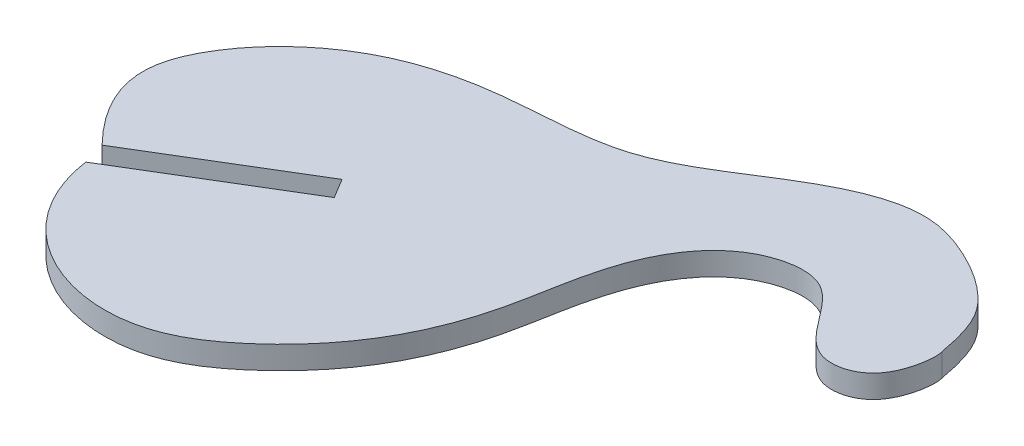
ISO-10303-21;
HEADER;
FILE_DESCRIPTION(('STEP AP214'),'2;1');
FILE_NAME('part.step','',(''),(''),'','','');
FILE_SCHEMA(('AUTOMOTIVE_DESIGN { 1 0 10303 214 1 1 1 1 }'));
ENDSEC;
DATA;
#1=APPLICATION_CONTEXT('core data for automotive mechanical design processes');
#2=APPLICATION_PROTOCOL_DEFINITION('international standard','automotive_design',2000,#1);
#3=PRODUCT_CONTEXT('',#1,'mechanical');
#4=PRODUCT('Part','Part','',(#3));
#5=PRODUCT_RELATED_PRODUCT_CATEGORY('part','',(#4));
#6=PRODUCT_DEFINITION_FORMATION('','',#4);
#7=PRODUCT_DEFINITION_CONTEXT('part definition',#1,'design');
#8=PRODUCT_DEFINITION('design','',#6,#7);
#9=PRODUCT_DEFINITION_SHAPE('','',#8);
#10=(LENGTH_UNIT() NAMED_UNIT(*) SI_UNIT(.MILLI.,.METRE.));
#11=(NAMED_UNIT(*) PLANE_ANGLE_UNIT() SI_UNIT($,.RADIAN.));
#12=(NAMED_UNIT(*) SI_UNIT($,.STERADIAN.) SOLID_ANGLE_UNIT());
#13=UNCERTAINTY_MEASURE_WITH_UNIT(LENGTH_MEASURE(1.E-05),#10,'distance_accuracy_value','');
#14=(GEOMETRIC_REPRESENTATION_CONTEXT(3) GLOBAL_UNCERTAINTY_ASSIGNED_CONTEXT((#13)) GLOBAL_UNIT_ASSIGNED_CONTEXT((#10,
#11,#12)) REPRESENTATION_CONTEXT('',''));
#15=CARTESIAN_POINT('',(0.,0.,0.));
#16=DIRECTION('',(0.,0.,1.));
#17=DIRECTION('',(1.,0.,0.));
#18=AXIS2_PLACEMENT_3D('',#15,#16,#17);
#19=CARTESIAN_POINT('',(60.4885775472052,4.,-23.5065893448949));
#20=CARTESIAN_POINT('',(62.895902112553,4.,-6.92111666186067));
#21=CARTESIAN_POINT('',(84.5675195844552,4.,2.35760458287842));
#22=CARTESIAN_POINT('',(104.110411774272,4.,-11.0857781396281));
#23=CARTESIAN_POINT('',(113.657175750317,4.,-22.5602791671201));
#24=CARTESIAN_POINT('',(119.803810224865,4.,-38.6049534869573));
#25=CARTESIAN_POINT('',(121.0986167671,4.,-55.0207996336318));
#26=CARTESIAN_POINT('',(130.002070286779,4.,-68.6630566019492));
#27=CARTESIAN_POINT('',(146.093483495039,4.,-71.4221055779034));
#28=CARTESIAN_POINT('',(150.477837292042,4.,-56.1205175671407));
#29=CARTESIAN_POINT('',(163.28035621263,4.,-59.5227082212777));
#30=CARTESIAN_POINT('',(164.350326554387,4.,-68.2473060734367));
#31=CARTESIAN_POINT('',(163.826427386985,4.,-69.6022177132712));
#32=B_SPLINE_CURVE_WITH_KNOTS('',3,(#19,#20,#21,#22,#23,#24,#25,#26,#27,#28,#29,#30,#31),
.UNSPECIFIED.,.F.,.F.,(4,1,1,1,1,1,1,1,1,1,4),(0.,0.240941344747515,0.320004977452503,
0.431098522133982,0.516272823994535,0.636822620629302,0.738022493481436,0.797504035703386,
0.89593012066054,0.943447284958325,1.),.UNSPECIFIED.);
#33=DIRECTION('',(0.,-1.,0.));
#34=VECTOR('',#33,1.);
#35=SURFACE_OF_LINEAR_EXTRUSION('',#32,#34);
#36=CARTESIAN_POINT('',(60.4885775472052,0.,-23.5065893448949));
#37=CARTESIAN_POINT('',(62.895902112553,0.,-6.92111666186067));
#38=CARTESIAN_POINT('',(84.5675195844552,0.,2.35760458287842));
#39=CARTESIAN_POINT('',(104.110411774272,0.,-11.0857781396281));
#40=CARTESIAN_POINT('',(113.657175750317,0.,-22.5602791671201));
#41=CARTESIAN_POINT('',(119.803810224865,0.,-38.6049534869573));
#42=CARTESIAN_POINT('',(121.0986167671,0.,-55.0207996336318));
#43=CARTESIAN_POINT('',(130.002070286779,0.,-68.6630566019492));
#44=CARTESIAN_POINT('',(146.093483495039,0.,-71.4221055779034));
#45=CARTESIAN_POINT('',(150.477837292042,0.,-56.1205175671407));
#46=CARTESIAN_POINT('',(163.28035621263,0.,-59.5227082212777));
#47=CARTESIAN_POINT('',(164.350326554387,0.,-68.2473060734367));
#48=CARTESIAN_POINT('',(163.826427386985,0.,-69.6022177132712));
#49=B_SPLINE_CURVE_WITH_KNOTS('',3,(#36,#37,#38,#39,#40,#41,#42,#43,#44,#45,#46,#47,#48),
.UNSPECIFIED.,.F.,.F.,(4,1,1,1,1,1,1,1,1,1,4),(0.,0.240941344747515,0.320004977452503,
0.431098522133982,0.516272823994535,0.636822620629302,0.738022493481436,0.797504035703386,
0.89593012066054,0.943447284958325,1.),.UNSPECIFIED.);
#50=CARTESIAN_POINT('',(60.4885775472053,0.,-23.5065893448947));
#51=VERTEX_POINT('',#50);
#52=CARTESIAN_POINT('',(163.826427386985,0.,-69.6022177132712));
#53=VERTEX_POINT('',#52);
#54=EDGE_CURVE('E119',#51,#53,#49,.T.);
#55=ORIENTED_EDGE('',*,*,#54,.T.);
#56=DIRECTION('',(0.,-1.,0.));
#57=VECTOR('',#56,1.);
#58=CARTESIAN_POINT('',(163.826427386985,4.,-69.6022177132712));
#59=LINE('',#58,#57);
#60=CARTESIAN_POINT('',(163.826427386985,4.,-69.6022177132712));
#61=VERTEX_POINT('',#60);
#62=EDGE_CURVE('E11',#61,#53,#59,.T.);
#63=ORIENTED_EDGE('',*,*,#62,.F.);
#64=CARTESIAN_POINT('',(60.4885775472053,4.,-23.5065893448947));
#65=VERTEX_POINT('',#64);
#66=EDGE_CURVE('E142',#65,#61,#32,.T.);
#67=ORIENTED_EDGE('',*,*,#66,.F.);
#68=DIRECTION('',(0.,-1.,0.));
#69=VECTOR('',#68,1.);
#70=CARTESIAN_POINT('',(60.4885775472053,4.,-23.5065893448947));
#71=LINE('',#70,#69);
#72=EDGE_CURVE('E115',#65,#51,#71,.T.);
#73=ORIENTED_EDGE('',*,*,#72,.T.);
#74=EDGE_LOOP('',(#55,#63,#67,#73));
#75=FACE_BOUND('',#74,.T.);
#76=ADVANCED_FACE('F39',(#75),#35,.F.);
#77=CARTESIAN_POINT('',(163.826427386985,4.,-69.6022177132712));
#78=CARTESIAN_POINT('',(162.712049588277,4.,-76.0590040201359));
#79=CARTESIAN_POINT('',(159.449728589503,4.,-81.2232536451375));
#80=CARTESIAN_POINT('',(151.425014844717,4.,-86.3412051298552));
#81=CARTESIAN_POINT('',(141.526903834125,4.,-89.62626001308));
#82=CARTESIAN_POINT('',(125.411823952363,4.,-84.4425529351401));
#83=CARTESIAN_POINT('',(109.674416258906,4.,-70.1140505927943));
#84=CARTESIAN_POINT('',(87.0869396915484,4.,-70.7587374670331));
#85=CARTESIAN_POINT('',(67.9818020791697,4.,-65.8518584670734));
#86=CARTESIAN_POINT('',(52.2594089300964,4.,-51.7852374759618));
#87=CARTESIAN_POINT('',(49.5651702198547,4.,-37.5209251478912));
#88=CARTESIAN_POINT('',(59.3519768980923,4.,-27.4921168968922));
#89=B_SPLINE_CURVE_WITH_KNOTS('',3,(#77,#78,#79,#80,#81,#82,#83,#84,#85,#86,#87,#88),
.UNSPECIFIED.,.F.,.F.,(4,1,1,1,1,1,1,1,1,4),(0.,0.0621369621535549,0.129358076846969,
0.186341704920315,0.269916959962739,0.458076549450093,0.600563620941992,0.712354200751066,
0.857805146276789,1.),.UNSPECIFIED.);
#90=DIRECTION('',(0.,-1.,0.));
#91=VECTOR('',#90,1.);
#92=SURFACE_OF_LINEAR_EXTRUSION('',#89,#91);
#93=CARTESIAN_POINT('',(163.826427386985,0.,-69.6022177132712));
#94=CARTESIAN_POINT('',(162.712049588277,0.,-76.0590040201359));
#95=CARTESIAN_POINT('',(159.449728589503,0.,-81.2232536451375));
#96=CARTESIAN_POINT('',(151.425014844717,0.,-86.3412051298552));
#97=CARTESIAN_POINT('',(141.526903834125,0.,-89.62626001308));
#98=CARTESIAN_POINT('',(125.411823952363,0.,-84.4425529351401));
#99=CARTESIAN_POINT('',(109.674416258906,0.,-70.1140505927943));
#100=CARTESIAN_POINT('',(87.0869396915484,0.,-70.7587374670331));
#101=CARTESIAN_POINT('',(67.9818020791697,0.,-65.8518584670734));
#102=CARTESIAN_POINT('',(52.2594089300964,0.,-51.7852374759618));
#103=CARTESIAN_POINT('',(49.5651702198547,0.,-37.5209251478912));
#104=CARTESIAN_POINT('',(59.3519768980923,0.,-27.4921168968922));
#105=B_SPLINE_CURVE_WITH_KNOTS('',3,(#93,#94,#95,#96,#97,#98,#99,#100,#101,#102,#103,#104),
.UNSPECIFIED.,.F.,.F.,(4,1,1,1,1,1,1,1,1,4),(0.,0.0621369621535549,0.129358076846969,
0.186341704920315,0.269916959962739,0.458076549450093,0.600563620941992,0.712354200751066,
0.857805146276789,1.),.UNSPECIFIED.);
#106=CARTESIAN_POINT('',(59.3519768980923,0.,-27.4921168968922));
#107=VERTEX_POINT('',#106);
#108=EDGE_CURVE('E125',#53,#107,#105,.T.);
#109=ORIENTED_EDGE('',*,*,#108,.T.);
#110=DIRECTION('',(0.,-1.,0.));
#111=VECTOR('',#110,1.);
#112=CARTESIAN_POINT('',(59.3519768980923,4.,-27.4921168968922));
#113=LINE('',#112,#111);
#114=CARTESIAN_POINT('',(59.3519768980923,4.,-27.4921168968922));
#115=VERTEX_POINT('',#114);
#116=EDGE_CURVE('E49',#115,#107,#113,.T.);
#117=ORIENTED_EDGE('',*,*,#116,.F.);
#118=EDGE_CURVE('E91',#61,#115,#89,.T.);
#119=ORIENTED_EDGE('',*,*,#118,.F.);
#120=ORIENTED_EDGE('',*,*,#62,.T.);
#121=EDGE_LOOP('',(#109,#117,#119,#120));
#122=FACE_BOUND('',#121,.T.);
#123=ADVANCED_FACE('F164',(#122),#92,.F.);
#124=CARTESIAN_POINT('',(59.3519768980923,4.,-27.4921168968922));
#125=DIRECTION('',(-0.516350362974261,0.,-0.856377430025073));
#126=DIRECTION('',(-0.856377430025073,0.,0.516350362974261));
#127=AXIS2_PLACEMENT_3D('',#124,#125,#126);
#128=PLANE('',#127);
#129=DIRECTION('',(0.856377430025073,0.,-0.516350362974261));
#130=VECTOR('',#129,1.);
#131=CARTESIAN_POINT('',(59.3519768980923,0.,-27.4921168968922));
#132=LINE('',#131,#130);
#133=CARTESIAN_POINT('',(85.474313530421,0.,-43.2425063033994));
#134=VERTEX_POINT('',#133);
#135=EDGE_CURVE('E107',#107,#134,#132,.T.);
#136=ORIENTED_EDGE('',*,*,#135,.T.);
#137=DIRECTION('',(0.,-1.,0.));
#138=VECTOR('',#137,1.);
#139=CARTESIAN_POINT('',(85.474313530421,4.,-43.2425063033994));
#140=LINE('',#139,#138);
#141=CARTESIAN_POINT('',(85.474313530421,4.,-43.2425063033994));
#142=VERTEX_POINT('',#141);
#143=EDGE_CURVE('E104',#142,#134,#140,.T.);
#144=ORIENTED_EDGE('',*,*,#143,.F.);
#145=DIRECTION('',(0.856377430025073,0.,-0.516350362974261));
#146=VECTOR('',#145,1.);
#147=CARTESIAN_POINT('',(59.3519768980923,4.,-27.4921168968922));
#148=LINE('',#147,#146);
#149=EDGE_CURVE('E95',#115,#142,#148,.T.);
#150=ORIENTED_EDGE('',*,*,#149,.F.);
#151=ORIENTED_EDGE('',*,*,#116,.T.);
#152=EDGE_LOOP('',(#136,#144,#150,#151));
#153=FACE_BOUND('',#152,.T.);
#154=ADVANCED_FACE('F105',(#153),#128,.F.);
#155=CARTESIAN_POINT('',(85.474313530421,4.,-43.2425063033994));
#156=DIRECTION('',(0.856377430025071,0.,-0.516350362974264));
#157=DIRECTION('',(-0.516350362974264,0.,-0.856377430025071));
#158=AXIS2_PLACEMENT_3D('',#155,#156,#157);
#159=PLANE('',#158);
#160=DIRECTION('',(0.516350362974264,0.,0.856377430025071));
#161=VECTOR('',#160,1.);
#162=CARTESIAN_POINT('',(85.474313530421,0.,-43.2425063033994));
#163=LINE('',#162,#161);
#164=CARTESIAN_POINT('',(87.539714982318,0.,-39.8169965832991));
#165=VERTEX_POINT('',#164);
#166=EDGE_CURVE('E77',#134,#165,#163,.T.);
#167=ORIENTED_EDGE('',*,*,#166,.T.);
#168=DIRECTION('',(0.,-1.,0.));
#169=VECTOR('',#168,1.);
#170=CARTESIAN_POINT('',(87.539714982318,4.,-39.8169965832991));
#171=LINE('',#170,#169);
#172=CARTESIAN_POINT('',(87.539714982318,4.,-39.8169965832991));
#173=VERTEX_POINT('',#172);
#174=EDGE_CURVE('E109',#173,#165,#171,.T.);
#175=ORIENTED_EDGE('',*,*,#174,.F.);
#176=DIRECTION('',(0.516350362974264,0.,0.856377430025071));
#177=VECTOR('',#176,1.);
#178=CARTESIAN_POINT('',(85.474313530421,4.,-43.2425063033994));
#179=LINE('',#178,#177);
#180=EDGE_CURVE('E99',#142,#173,#179,.T.);
#181=ORIENTED_EDGE('',*,*,#180,.F.);
#182=ORIENTED_EDGE('',*,*,#143,.T.);
#183=EDGE_LOOP('',(#167,#175,#181,#182));
#184=FACE_BOUND('',#183,.T.);
#185=ADVANCED_FACE('F111',(#184),#159,.F.);
#186=CARTESIAN_POINT('',(87.539714982318,4.,-39.8169965832991));
#187=DIRECTION('',(0.516350362974262,0.,0.856377430025073));
#188=DIRECTION('',(0.856377430025073,0.,-0.516350362974262));
#189=AXIS2_PLACEMENT_3D('',#186,#187,#188);
#190=PLANE('',#189);
#191=DIRECTION('',(-0.856377430025072,0.,0.516350362974262));
#192=VECTOR('',#191,1.);
#193=CARTESIAN_POINT('',(87.539714982318,0.,-39.8169965832991));
#194=LINE('',#193,#192);
#195=EDGE_CURVE('E83',#165,#51,#194,.T.);
#196=ORIENTED_EDGE('',*,*,#195,.T.);
#197=ORIENTED_EDGE('',*,*,#72,.F.);
#198=DIRECTION('',(-0.856377430025072,0.,0.516350362974262));
#199=VECTOR('',#198,1.);
#200=CARTESIAN_POINT('',(87.539714982318,4.,-39.8169965832991));
#201=LINE('',#200,#199);
#202=EDGE_CURVE('E57',#173,#65,#201,.T.);
#203=ORIENTED_EDGE('',*,*,#202,.F.);
#204=ORIENTED_EDGE('',*,*,#174,.T.);
#205=EDGE_LOOP('',(#196,#197,#203,#204));
#206=FACE_BOUND('',#205,.T.);
#207=ADVANCED_FACE('F153',(#206),#190,.F.);
#208=CARTESIAN_POINT('',(117.882988172361,4.,-34.3964594474485));
#209=DIRECTION('',(0.,1.,0.));
#210=DIRECTION('',(0.,0.,1.));
#211=AXIS2_PLACEMENT_3D('',#208,#209,#210);
#212=PLANE('',#211);
#213=ORIENTED_EDGE('',*,*,#66,.T.);
#214=ORIENTED_EDGE('',*,*,#118,.T.);
#215=ORIENTED_EDGE('',*,*,#149,.T.);
#216=ORIENTED_EDGE('',*,*,#180,.T.);
#217=ORIENTED_EDGE('',*,*,#202,.T.);
#218=EDGE_LOOP('',(#213,#214,#215,#216,#217));
#219=FACE_BOUND('',#218,.T.);
#220=ADVANCED_FACE('F97',(#219),#212,.T.);
#221=CARTESIAN_POINT('',(117.882988172361,0.,-34.3964594474485));
#222=DIRECTION('',(0.,1.,0.));
#223=DIRECTION('',(0.,0.,1.));
#224=AXIS2_PLACEMENT_3D('',#221,#222,#223);
#225=PLANE('',#224);
#226=ORIENTED_EDGE('',*,*,#54,.F.);
#227=ORIENTED_EDGE('',*,*,#195,.F.);
#228=ORIENTED_EDGE('',*,*,#166,.F.);
#229=ORIENTED_EDGE('',*,*,#135,.F.);
#230=ORIENTED_EDGE('',*,*,#108,.F.);
#231=EDGE_LOOP('',(#226,#227,#228,#229,#230));
#232=FACE_BOUND('',#231,.T.);
#233=ADVANCED_FACE('F149',(#232),#225,.F.);
#234=CLOSED_SHELL('',(#76,#123,#154,#185,#207,#220,#233));
#235=MANIFOLD_SOLID_BREP('B2',#234);
#236=ADVANCED_BREP_SHAPE_REPRESENTATION('',(#18,#235),#14);
#237=SHAPE_DEFINITION_REPRESENTATION(#9,#236);
ENDSEC;
END-ISO-10303-21;
